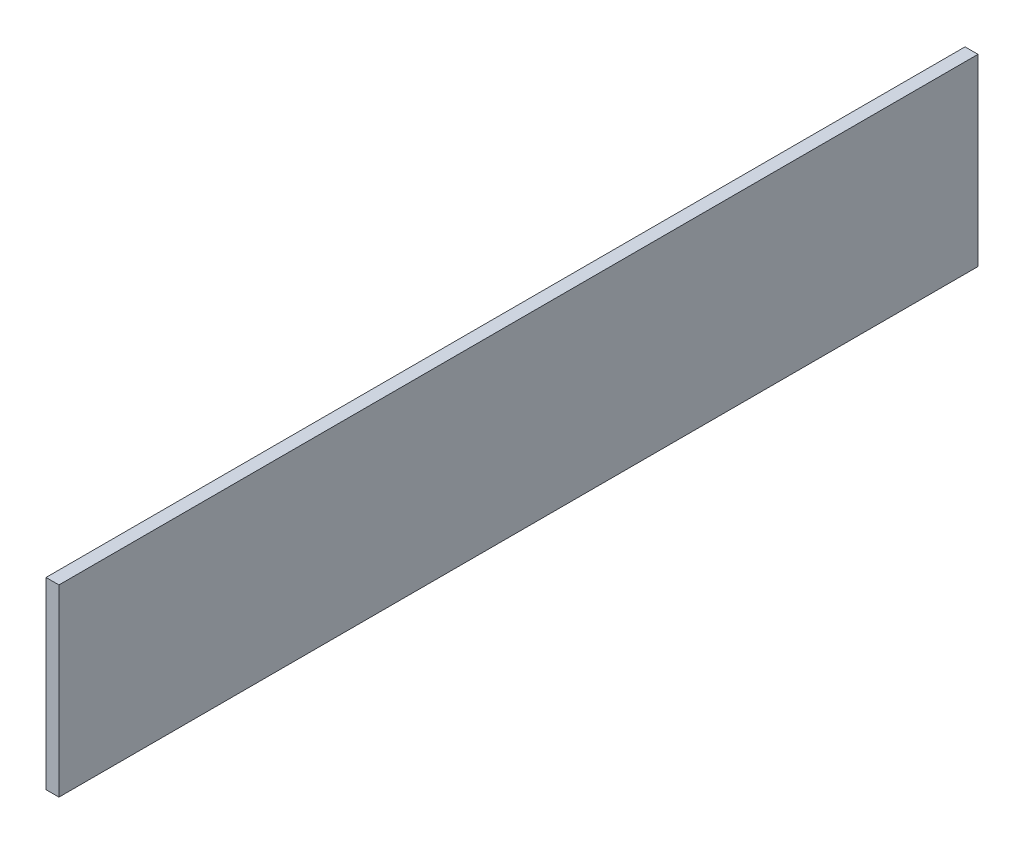
ISO-10303-21;
HEADER;
FILE_DESCRIPTION(('STEP AP214'),'2;1');
FILE_NAME('part.step','',(''),(''),'','','');
FILE_SCHEMA(('AUTOMOTIVE_DESIGN { 1 0 10303 214 1 1 1 1 }'));
ENDSEC;
DATA;
#1=APPLICATION_CONTEXT('core data for automotive mechanical design processes');
#2=APPLICATION_PROTOCOL_DEFINITION('international standard','automotive_design',2000,#1);
#3=PRODUCT_CONTEXT('',#1,'mechanical');
#4=PRODUCT('Part','Part','',(#3));
#5=PRODUCT_RELATED_PRODUCT_CATEGORY('part','',(#4));
#6=PRODUCT_DEFINITION_FORMATION('','',#4);
#7=PRODUCT_DEFINITION_CONTEXT('part definition',#1,'design');
#8=PRODUCT_DEFINITION('design','',#6,#7);
#9=PRODUCT_DEFINITION_SHAPE('','',#8);
#10=(LENGTH_UNIT() NAMED_UNIT(*) SI_UNIT(.MILLI.,.METRE.));
#11=(NAMED_UNIT(*) PLANE_ANGLE_UNIT() SI_UNIT($,.RADIAN.));
#12=(NAMED_UNIT(*) SI_UNIT($,.STERADIAN.) SOLID_ANGLE_UNIT());
#13=UNCERTAINTY_MEASURE_WITH_UNIT(LENGTH_MEASURE(1.E-05),#10,'distance_accuracy_value','');
#14=(GEOMETRIC_REPRESENTATION_CONTEXT(3) GLOBAL_UNCERTAINTY_ASSIGNED_CONTEXT((#13)) GLOBAL_UNIT_ASSIGNED_CONTEXT((#10,
#11,#12)) REPRESENTATION_CONTEXT('',''));
#15=CARTESIAN_POINT('',(0.,0.,0.));
#16=DIRECTION('',(0.,0.,1.));
#17=DIRECTION('',(1.,0.,0.));
#18=AXIS2_PLACEMENT_3D('',#15,#16,#17);
#19=CARTESIAN_POINT('',(5.,-18.7283464566929,88.3307086614173));
#20=DIRECTION('',(0.,0.,-1.));
#21=DIRECTION('',(-1.,0.,0.));
#22=AXIS2_PLACEMENT_3D('',#19,#20,#21);
#23=PLANE('',#22);
#24=DIRECTION('',(0.,-1.,0.));
#25=VECTOR('',#24,1.);
#26=CARTESIAN_POINT('',(0.,-18.7283464566929,88.3307086614173));
#27=LINE('',#26,#25);
#28=CARTESIAN_POINT('',(0.,52.2716535433071,88.3307086614173));
#29=VERTEX_POINT('',#28);
#30=CARTESIAN_POINT('',(0.,-18.7283464566929,88.3307086614173));
#31=VERTEX_POINT('',#30);
#32=EDGE_CURVE('E95',#29,#31,#27,.T.);
#33=ORIENTED_EDGE('',*,*,#32,.T.);
#34=DIRECTION('',(-1.,0.,0.));
#35=VECTOR('',#34,1.);
#36=CARTESIAN_POINT('',(5.,-18.7283464566929,88.3307086614173));
#37=LINE('',#36,#35);
#38=CARTESIAN_POINT('',(5.,-18.7283464566929,88.3307086614173));
#39=VERTEX_POINT('',#38);
#40=EDGE_CURVE('E11',#39,#31,#37,.T.);
#41=ORIENTED_EDGE('',*,*,#40,.F.);
#42=DIRECTION('',(0.,-1.,0.));
#43=VECTOR('',#42,1.);
#44=CARTESIAN_POINT('',(5.,-18.7283464566929,88.3307086614173));
#45=LINE('',#44,#43);
#46=CARTESIAN_POINT('',(5.,52.2716535433071,88.3307086614173));
#47=VERTEX_POINT('',#46);
#48=EDGE_CURVE('E83',#47,#39,#45,.T.);
#49=ORIENTED_EDGE('',*,*,#48,.F.);
#50=DIRECTION('',(-1.,0.,0.));
#51=VECTOR('',#50,1.);
#52=CARTESIAN_POINT('',(5.,52.2716535433071,88.3307086614173));
#53=LINE('',#52,#51);
#54=EDGE_CURVE('E91',#47,#29,#53,.T.);
#55=ORIENTED_EDGE('',*,*,#54,.T.);
#56=EDGE_LOOP('',(#33,#41,#49,#55));
#57=FACE_BOUND('',#56,.T.);
#58=ADVANCED_FACE('F32',(#57),#23,.F.);
#59=CARTESIAN_POINT('',(5.,-18.7283464566929,88.3307086614173));
#60=DIRECTION('',(0.,1.,0.));
#61=DIRECTION('',(0.,0.,1.));
#62=AXIS2_PLACEMENT_3D('',#59,#60,#61);
#63=PLANE('',#62);
#64=DIRECTION('',(0.,0.,-1.));
#65=VECTOR('',#64,1.);
#66=CARTESIAN_POINT('',(0.,-18.7283464566929,88.3307086614173));
#67=LINE('',#66,#65);
#68=CARTESIAN_POINT('',(0.,-18.7283464566929,-266.669291338583));
#69=VERTEX_POINT('',#68);
#70=EDGE_CURVE('E87',#31,#69,#67,.T.);
#71=ORIENTED_EDGE('',*,*,#70,.T.);
#72=DIRECTION('',(-1.,0.,0.));
#73=VECTOR('',#72,1.);
#74=CARTESIAN_POINT('',(5.,-18.7283464566929,-266.669291338583));
#75=LINE('',#74,#73);
#76=CARTESIAN_POINT('',(5.,-18.7283464566929,-266.669291338583));
#77=VERTEX_POINT('',#76);
#78=EDGE_CURVE('E40',#77,#69,#75,.T.);
#79=ORIENTED_EDGE('',*,*,#78,.F.);
#80=DIRECTION('',(0.,0.,-1.));
#81=VECTOR('',#80,1.);
#82=CARTESIAN_POINT('',(5.,-18.7283464566929,88.3307086614173));
#83=LINE('',#82,#81);
#84=EDGE_CURVE('E78',#39,#77,#83,.T.);
#85=ORIENTED_EDGE('',*,*,#84,.F.);
#86=ORIENTED_EDGE('',*,*,#40,.T.);
#87=EDGE_LOOP('',(#71,#79,#85,#86));
#88=FACE_BOUND('',#87,.T.);
#89=ADVANCED_FACE('F86',(#88),#63,.F.);
#90=CARTESIAN_POINT('',(5.,-18.7283464566929,-266.669291338583));
#91=DIRECTION('',(0.,0.,1.));
#92=DIRECTION('',(1.,0.,0.));
#93=AXIS2_PLACEMENT_3D('',#90,#91,#92);
#94=PLANE('',#93);
#95=DIRECTION('',(0.,1.,0.));
#96=VECTOR('',#95,1.);
#97=CARTESIAN_POINT('',(0.,-18.7283464566929,-266.669291338583));
#98=LINE('',#97,#96);
#99=CARTESIAN_POINT('',(0.,52.2716535433071,-266.669291338583));
#100=VERTEX_POINT('',#99);
#101=EDGE_CURVE('E65',#69,#100,#98,.T.);
#102=ORIENTED_EDGE('',*,*,#101,.T.);
#103=DIRECTION('',(-1.,0.,0.));
#104=VECTOR('',#103,1.);
#105=CARTESIAN_POINT('',(5.,52.2716535433071,-266.669291338583));
#106=LINE('',#105,#104);
#107=CARTESIAN_POINT('',(5.,52.2716535433071,-266.669291338583));
#108=VERTEX_POINT('',#107);
#109=EDGE_CURVE('E88',#108,#100,#106,.T.);
#110=ORIENTED_EDGE('',*,*,#109,.F.);
#111=DIRECTION('',(0.,1.,0.));
#112=VECTOR('',#111,1.);
#113=CARTESIAN_POINT('',(5.,-18.7283464566929,-266.669291338583));
#114=LINE('',#113,#112);
#115=EDGE_CURVE('E81',#77,#108,#114,.T.);
#116=ORIENTED_EDGE('',*,*,#115,.F.);
#117=ORIENTED_EDGE('',*,*,#78,.T.);
#118=EDGE_LOOP('',(#102,#110,#116,#117));
#119=FACE_BOUND('',#118,.T.);
#120=ADVANCED_FACE('F89',(#119),#94,.F.);
#121=CARTESIAN_POINT('',(5.,52.2716535433071,88.3307086614173));
#122=DIRECTION('',(0.,-1.,0.));
#123=DIRECTION('',(0.,0.,-1.));
#124=AXIS2_PLACEMENT_3D('',#121,#122,#123);
#125=PLANE('',#124);
#126=DIRECTION('',(0.,0.,1.));
#127=VECTOR('',#126,1.);
#128=CARTESIAN_POINT('',(0.,52.2716535433071,88.3307086614173));
#129=LINE('',#128,#127);
#130=EDGE_CURVE('E71',#100,#29,#129,.T.);
#131=ORIENTED_EDGE('',*,*,#130,.T.);
#132=ORIENTED_EDGE('',*,*,#54,.F.);
#133=DIRECTION('',(0.,0.,1.));
#134=VECTOR('',#133,1.);
#135=CARTESIAN_POINT('',(5.,52.2716535433071,88.3307086614173));
#136=LINE('',#135,#134);
#137=EDGE_CURVE('E48',#108,#47,#136,.T.);
#138=ORIENTED_EDGE('',*,*,#137,.F.);
#139=ORIENTED_EDGE('',*,*,#109,.T.);
#140=EDGE_LOOP('',(#131,#132,#138,#139));
#141=FACE_BOUND('',#140,.T.);
#142=ADVANCED_FACE('F102',(#141),#125,.F.);
#143=CARTESIAN_POINT('',(5.,0.,0.));
#144=DIRECTION('',(-1.,0.,0.));
#145=DIRECTION('',(0.,0.,1.));
#146=AXIS2_PLACEMENT_3D('',#143,#144,#145);
#147=PLANE('',#146);
#148=ORIENTED_EDGE('',*,*,#48,.T.);
#149=ORIENTED_EDGE('',*,*,#84,.T.);
#150=ORIENTED_EDGE('',*,*,#115,.T.);
#151=ORIENTED_EDGE('',*,*,#137,.T.);
#152=EDGE_LOOP('',(#148,#149,#150,#151));
#153=FACE_BOUND('',#152,.T.);
#154=ADVANCED_FACE('F79',(#153),#147,.F.);
#155=CARTESIAN_POINT('',(0.,0.,0.));
#156=DIRECTION('',(-1.,0.,0.));
#157=DIRECTION('',(0.,0.,1.));
#158=AXIS2_PLACEMENT_3D('',#155,#156,#157);
#159=PLANE('',#158);
#160=ORIENTED_EDGE('',*,*,#32,.F.);
#161=ORIENTED_EDGE('',*,*,#130,.F.);
#162=ORIENTED_EDGE('',*,*,#101,.F.);
#163=ORIENTED_EDGE('',*,*,#70,.F.);
#164=EDGE_LOOP('',(#160,#161,#162,#163));
#165=FACE_BOUND('',#164,.T.);
#166=ADVANCED_FACE('F105',(#165),#159,.T.);
#167=CLOSED_SHELL('',(#58,#89,#120,#142,#154,#166));
#168=MANIFOLD_SOLID_BREP('B2',#167);
#169=ADVANCED_BREP_SHAPE_REPRESENTATION('',(#18,#168),#14);
#170=SHAPE_DEFINITION_REPRESENTATION(#9,#169);
ENDSEC;
END-ISO-10303-21;
